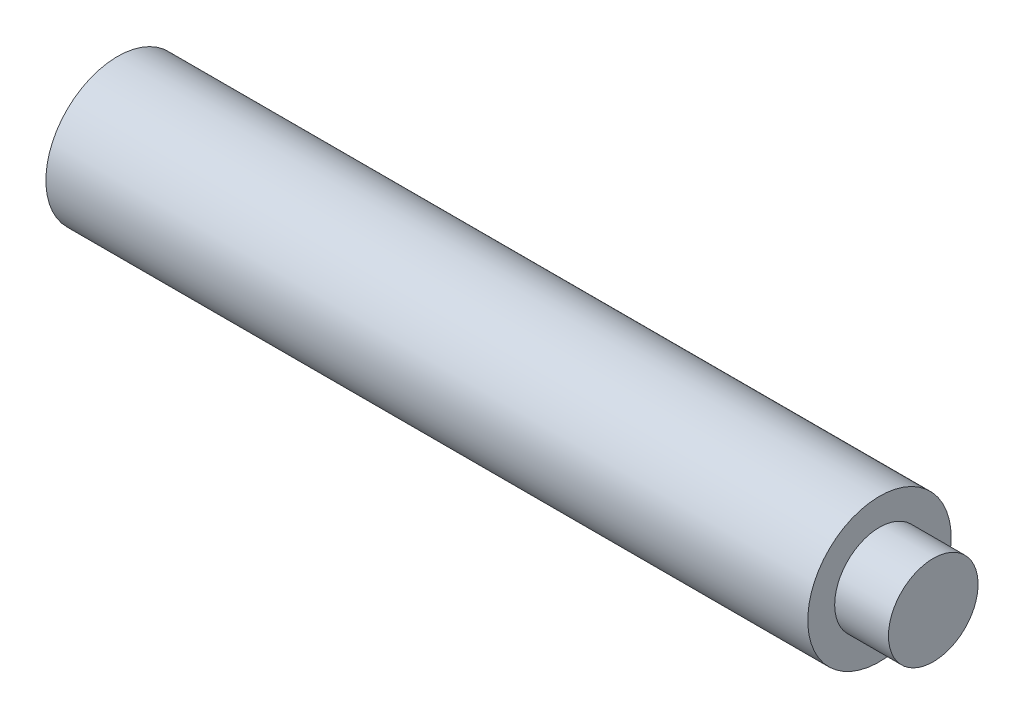
ISO-10303-21;
HEADER;
FILE_DESCRIPTION(('STEP AP214'),'2;1');
FILE_NAME('part.step','',(''),(''),'','','');
FILE_SCHEMA(('AUTOMOTIVE_DESIGN { 1 0 10303 214 1 1 1 1 }'));
ENDSEC;
DATA;
#1=APPLICATION_CONTEXT('core data for automotive mechanical design processes');
#2=APPLICATION_PROTOCOL_DEFINITION('international standard','automotive_design',2000,#1);
#3=PRODUCT_CONTEXT('',#1,'mechanical');
#4=PRODUCT('Part','Part','',(#3));
#5=PRODUCT_RELATED_PRODUCT_CATEGORY('part','',(#4));
#6=PRODUCT_DEFINITION_FORMATION('','',#4);
#7=PRODUCT_DEFINITION_CONTEXT('part definition',#1,'design');
#8=PRODUCT_DEFINITION('design','',#6,#7);
#9=PRODUCT_DEFINITION_SHAPE('','',#8);
#10=(LENGTH_UNIT() NAMED_UNIT(*) SI_UNIT(.MILLI.,.METRE.));
#11=(NAMED_UNIT(*) PLANE_ANGLE_UNIT() SI_UNIT($,.RADIAN.));
#12=(NAMED_UNIT(*) SI_UNIT($,.STERADIAN.) SOLID_ANGLE_UNIT());
#13=UNCERTAINTY_MEASURE_WITH_UNIT(LENGTH_MEASURE(1.E-05),#10,'distance_accuracy_value','');
#14=(GEOMETRIC_REPRESENTATION_CONTEXT(3) GLOBAL_UNCERTAINTY_ASSIGNED_CONTEXT((#13)) GLOBAL_UNIT_ASSIGNED_CONTEXT((#10,
#11,#12)) REPRESENTATION_CONTEXT('',''));
#15=CARTESIAN_POINT('',(0.,0.,0.));
#16=DIRECTION('',(0.,0.,1.));
#17=DIRECTION('',(1.,0.,0.));
#18=AXIS2_PLACEMENT_3D('',#15,#16,#17);
#19=CARTESIAN_POINT('',(539.75,0.,0.));
#20=DIRECTION('',(-1.,0.,0.));
#21=DIRECTION('',(0.,0.,1.));
#22=AXIS2_PLACEMENT_3D('',#19,#20,#21);
#23=CYLINDRICAL_SURFACE('',#22,101.6);
#24=CARTESIAN_POINT('',(539.75,0.,0.));
#25=DIRECTION('',(1.,0.,0.));
#26=DIRECTION('',(0.,0.,-1.));
#27=AXIS2_PLACEMENT_3D('',#24,#25,#26);
#28=CIRCLE('',#27,101.6);
#29=CARTESIAN_POINT('',(539.75,0.,-101.6));
#30=VERTEX_POINT('',#29);
#31=EDGE_CURVE('E39',#30,#30,#28,.T.);
#32=ORIENTED_EDGE('',*,*,#31,.F.);
#33=EDGE_LOOP('',(#32));
#34=FACE_BOUND('',#33,.T.);
#35=CARTESIAN_POINT('',(-539.75,0.,0.));
#36=DIRECTION('',(1.,0.,0.));
#37=DIRECTION('',(0.,0.,-1.));
#38=AXIS2_PLACEMENT_3D('',#35,#36,#37);
#39=CIRCLE('',#38,101.6);
#40=CARTESIAN_POINT('',(-539.75,0.,-101.6));
#41=VERTEX_POINT('',#40);
#42=EDGE_CURVE('E35',#41,#41,#39,.T.);
#43=ORIENTED_EDGE('',*,*,#42,.T.);
#44=EDGE_LOOP('',(#43));
#45=FACE_BOUND('',#44,.T.);
#46=ADVANCED_FACE('F32',(#34,#45),#23,.T.);
#47=CARTESIAN_POINT('',(539.75,0.,0.));
#48=DIRECTION('',(1.,0.,0.));
#49=DIRECTION('',(0.,0.,-1.));
#50=AXIS2_PLACEMENT_3D('',#47,#48,#49);
#51=PLANE('',#50);
#52=CARTESIAN_POINT('',(539.75,0.,0.));
#53=DIRECTION('',(1.,0.,0.));
#54=DIRECTION('',(0.,0.,-1.));
#55=AXIS2_PLACEMENT_3D('',#52,#53,#54);
#56=CIRCLE('',#55,63.5);
#57=CARTESIAN_POINT('',(539.75,0.,63.5));
#58=VERTEX_POINT('',#57);
#59=EDGE_CURVE('E10',#58,#58,#56,.T.);
#60=ORIENTED_EDGE('',*,*,#59,.F.);
#61=EDGE_LOOP('',(#60));
#62=FACE_BOUND('',#61,.T.);
#63=ORIENTED_EDGE('',*,*,#31,.T.);
#64=EDGE_LOOP('',(#63));
#65=FACE_BOUND('',#64,.T.);
#66=ADVANCED_FACE('F56',(#62,#65),#51,.T.);
#67=CARTESIAN_POINT('',(-539.75,0.,0.));
#68=DIRECTION('',(1.,0.,0.));
#69=DIRECTION('',(0.,0.,-1.));
#70=AXIS2_PLACEMENT_3D('',#67,#68,#69);
#71=PLANE('',#70);
#72=ORIENTED_EDGE('',*,*,#42,.F.);
#73=EDGE_LOOP('',(#72));
#74=FACE_BOUND('',#73,.T.);
#75=ADVANCED_FACE('F53',(#74),#71,.F.);
#76=CARTESIAN_POINT('',(615.95,0.,0.));
#77=DIRECTION('',(-1.,0.,0.));
#78=DIRECTION('',(0.,0.,1.));
#79=AXIS2_PLACEMENT_3D('',#76,#77,#78);
#80=CYLINDRICAL_SURFACE('',#79,63.5);
#81=CARTESIAN_POINT('',(615.95,0.,0.));
#82=DIRECTION('',(1.,0.,0.));
#83=DIRECTION('',(0.,0.,-1.));
#84=AXIS2_PLACEMENT_3D('',#81,#82,#83);
#85=CIRCLE('',#84,63.5);
#86=CARTESIAN_POINT('',(615.95,0.,63.5));
#87=VERTEX_POINT('',#86);
#88=EDGE_CURVE('E45',#87,#87,#85,.T.);
#89=CARTESIAN_POINT('',(615.95,0.,63.5));
#90=CARTESIAN_POINT('',(615.15625,0.,63.5));
#91=CARTESIAN_POINT('',(614.3625,0.,63.5));
#92=CARTESIAN_POINT('',(612.775,0.,63.5));
#93=CARTESIAN_POINT('',(611.98125,0.,63.5));
#94=CARTESIAN_POINT('',(610.39375,0.,63.5));
#95=CARTESIAN_POINT('',(609.6,0.,63.5));
#96=CARTESIAN_POINT('',(608.0125,0.,63.5));
#97=CARTESIAN_POINT('',(607.21875,0.,63.5));
#98=CARTESIAN_POINT('',(605.63125,0.,63.5));
#99=CARTESIAN_POINT('',(604.8375,0.,63.5));
#100=CARTESIAN_POINT('',(603.25,0.,63.5));
#101=CARTESIAN_POINT('',(602.45625,0.,63.5));
#102=CARTESIAN_POINT('',(600.86875,0.,63.5));
#103=CARTESIAN_POINT('',(600.075,0.,63.5));
#104=CARTESIAN_POINT('',(598.4875,0.,63.5));
#105=CARTESIAN_POINT('',(597.69375,0.,63.5));
#106=CARTESIAN_POINT('',(596.10625,0.,63.5));
#107=CARTESIAN_POINT('',(595.3125,0.,63.5));
#108=CARTESIAN_POINT('',(593.725,0.,63.5));
#109=CARTESIAN_POINT('',(592.93125,0.,63.5));
#110=CARTESIAN_POINT('',(591.34375,0.,63.5));
#111=CARTESIAN_POINT('',(590.55,0.,63.5));
#112=CARTESIAN_POINT('',(588.9625,0.,63.5));
#113=CARTESIAN_POINT('',(588.16875,0.,63.5));
#114=CARTESIAN_POINT('',(586.58125,0.,63.5));
#115=CARTESIAN_POINT('',(585.7875,0.,63.5));
#116=CARTESIAN_POINT('',(584.2,0.,63.5));
#117=CARTESIAN_POINT('',(583.40625,0.,63.5));
#118=CARTESIAN_POINT('',(581.81875,0.,63.5));
#119=CARTESIAN_POINT('',(581.025,0.,63.5));
#120=CARTESIAN_POINT('',(579.4375,0.,63.5));
#121=CARTESIAN_POINT('',(578.64375,0.,63.5));
#122=CARTESIAN_POINT('',(577.05625,0.,63.5));
#123=CARTESIAN_POINT('',(576.2625,0.,63.5));
#124=CARTESIAN_POINT('',(574.675,0.,63.5));
#125=CARTESIAN_POINT('',(573.88125,0.,63.5));
#126=CARTESIAN_POINT('',(572.29375,0.,63.5));
#127=CARTESIAN_POINT('',(571.5,0.,63.5));
#128=CARTESIAN_POINT('',(569.9125,0.,63.5));
#129=CARTESIAN_POINT('',(569.11875,0.,63.5));
#130=CARTESIAN_POINT('',(567.53125,0.,63.5));
#131=CARTESIAN_POINT('',(566.7375,0.,63.5));
#132=CARTESIAN_POINT('',(565.15,0.,63.5));
#133=CARTESIAN_POINT('',(564.35625,0.,63.5));
#134=CARTESIAN_POINT('',(562.76875,0.,63.5));
#135=CARTESIAN_POINT('',(561.975,0.,63.5));
#136=CARTESIAN_POINT('',(560.3875,0.,63.5));
#137=CARTESIAN_POINT('',(559.59375,0.,63.5));
#138=CARTESIAN_POINT('',(558.00625,0.,63.5));
#139=CARTESIAN_POINT('',(557.2125,0.,63.5));
#140=CARTESIAN_POINT('',(555.625,0.,63.5));
#141=CARTESIAN_POINT('',(554.83125,0.,63.5));
#142=CARTESIAN_POINT('',(553.24375,0.,63.5));
#143=CARTESIAN_POINT('',(552.45,0.,63.5));
#144=CARTESIAN_POINT('',(550.8625,0.,63.5));
#145=CARTESIAN_POINT('',(550.06875,0.,63.5));
#146=CARTESIAN_POINT('',(548.48125,0.,63.5));
#147=CARTESIAN_POINT('',(547.6875,0.,63.5));
#148=CARTESIAN_POINT('',(546.1,0.,63.5));
#149=CARTESIAN_POINT('',(545.30625,0.,63.5));
#150=CARTESIAN_POINT('',(543.71875,0.,63.5));
#151=CARTESIAN_POINT('',(542.925,0.,63.5));
#152=CARTESIAN_POINT('',(541.3375,0.,63.5));
#153=CARTESIAN_POINT('',(540.54375,0.,63.5));
#154=CARTESIAN_POINT('',(539.75,0.,63.5));
#155=B_SPLINE_CURVE_WITH_KNOTS('',3,(#89,#90,#91,#92,#93,#94,#95,#96,#97,#98,#99,#100,#101,#102,
#103,#104,#105,#106,#107,#108,#109,#110,#111,#112,#113,#114,#115,#116,#117,#118,#119,#120,#121,
#122,#123,#124,#125,#126,#127,#128,#129,#130,#131,#132,#133,#134,#135,#136,#137,#138,#139,#140,
#141,#142,#143,#144,#145,#146,#147,#148,#149,#150,#151,#152,#153,#154),.UNSPECIFIED.,.F.,.F.,(4,
2,2,2,2,2,2,2,2,2,2,2,2,2,2,2,2,2,2,2,2,2,2,2,2,2,2,2,2,2,2,2,4),(0.,2.38125,4.7625,7.14375,
9.52500000000001,11.90625,14.2875,16.66875,19.05,21.43125,23.8125,26.19375,28.575,30.95625,
33.3375,35.71875,38.1,40.48125,42.8625,45.24375,47.625,50.00625,52.3875,54.76875,57.15,59.53125,
61.9125,64.29375,66.675,69.05625,71.4375,73.8187500000001,76.2),.UNSPECIFIED.);
#156=EDGE_CURVE('BSEAM55',#87,#58,#155,.T.);
#157=ORIENTED_EDGE('',*,*,#88,.F.);
#158=ORIENTED_EDGE('',*,*,#59,.T.);
#159=ORIENTED_EDGE('',*,*,#156,.T.);
#160=ORIENTED_EDGE('',*,*,#156,.F.);
#161=EDGE_LOOP('',(#157,#159,#158,#160));
#162=FACE_BOUND('',#161,.T.);
#163=ADVANCED_FACE('F55',(#162),#80,.T.);
#164=CARTESIAN_POINT('',(615.95,0.,0.));
#165=DIRECTION('',(1.,0.,0.));
#166=DIRECTION('',(0.,0.,-1.));
#167=AXIS2_PLACEMENT_3D('',#164,#165,#166);
#168=PLANE('',#167);
#169=ORIENTED_EDGE('',*,*,#88,.T.);
#170=EDGE_LOOP('',(#169));
#171=FACE_BOUND('',#170,.T.);
#172=ADVANCED_FACE('F61',(#171),#168,.T.);
#173=CLOSED_SHELL('',(#46,#66,#75,#163,#172));
#174=MANIFOLD_SOLID_BREP('B2',#173);
#175=ADVANCED_BREP_SHAPE_REPRESENTATION('',(#18,#174),#14);
#176=SHAPE_DEFINITION_REPRESENTATION(#9,#175);
ENDSEC;
END-ISO-10303-21;
